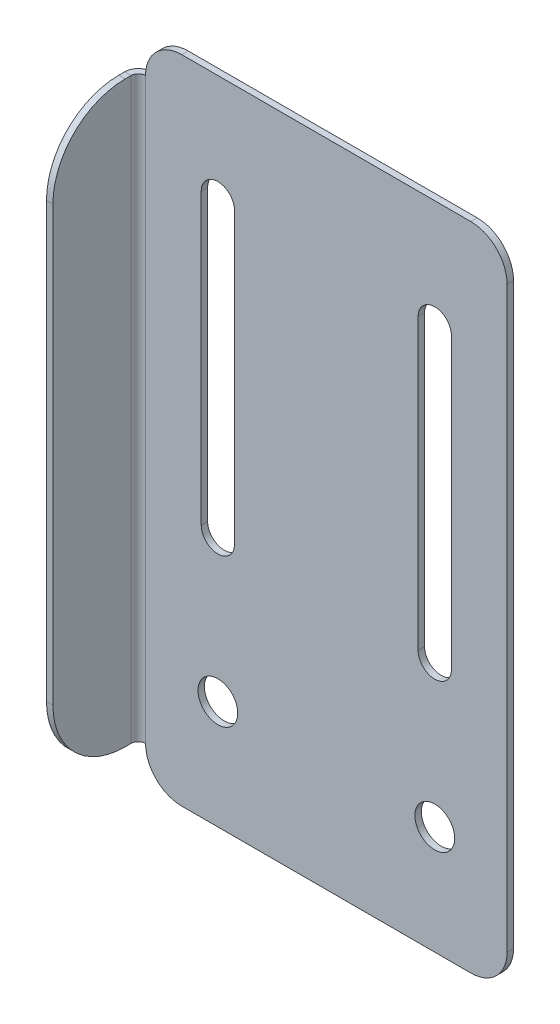
ISO-10303-21;
HEADER;
FILE_DESCRIPTION(('STEP AP214'),'2;1');
FILE_NAME('part.step','',(''),(''),'','','');
FILE_SCHEMA(('AUTOMOTIVE_DESIGN { 1 0 10303 214 1 1 1 1 }'));
ENDSEC;
DATA;
#1=APPLICATION_CONTEXT('core data for automotive mechanical design processes');
#2=APPLICATION_PROTOCOL_DEFINITION('international standard','automotive_design',2000,#1);
#3=PRODUCT_CONTEXT('',#1,'mechanical');
#4=PRODUCT('Part','Part','',(#3));
#5=PRODUCT_RELATED_PRODUCT_CATEGORY('part','',(#4));
#6=PRODUCT_DEFINITION_FORMATION('','',#4);
#7=PRODUCT_DEFINITION_CONTEXT('part definition',#1,'design');
#8=PRODUCT_DEFINITION('design','',#6,#7);
#9=PRODUCT_DEFINITION_SHAPE('','',#8);
#10=(LENGTH_UNIT() NAMED_UNIT(*) SI_UNIT(.MILLI.,.METRE.));
#11=(NAMED_UNIT(*) PLANE_ANGLE_UNIT() SI_UNIT($,.RADIAN.));
#12=(NAMED_UNIT(*) SI_UNIT($,.STERADIAN.) SOLID_ANGLE_UNIT());
#13=UNCERTAINTY_MEASURE_WITH_UNIT(LENGTH_MEASURE(1.E-05),#10,'distance_accuracy_value','');
#14=(GEOMETRIC_REPRESENTATION_CONTEXT(3) GLOBAL_UNCERTAINTY_ASSIGNED_CONTEXT((#13)) GLOBAL_UNIT_ASSIGNED_CONTEXT((#10,
#11,#12)) REPRESENTATION_CONTEXT('',''));
#15=CARTESIAN_POINT('',(0.,0.,0.));
#16=DIRECTION('',(0.,0.,1.));
#17=DIRECTION('',(1.,0.,0.));
#18=AXIS2_PLACEMENT_3D('',#15,#16,#17);
#19=CARTESIAN_POINT('',(0.,0.,0.889));
#20=DIRECTION('',(0.,0.,1.));
#21=DIRECTION('',(1.,0.,0.));
#22=AXIS2_PLACEMENT_3D('',#19,#20,#21);
#23=PLANE('',#22);
#24=CARTESIAN_POINT('',(61.7015913794371,-41.5,0.889));
#25=DIRECTION('',(0.,0.,-1.));
#26=DIRECTION('',(-1.,0.,0.));
#27=AXIS2_PLACEMENT_3D('',#24,#25,#26);
#28=CIRCLE('',#27,2.75);
#29=CARTESIAN_POINT('',(58.9515913794371,-41.5,0.889));
#30=VERTEX_POINT('',#29);
#31=EDGE_CURVE('E260',#30,#30,#28,.T.);
#32=ORIENTED_EDGE('',*,*,#31,.T.);
#33=EDGE_LOOP('',(#32));
#34=FACE_BOUND('',#33,.T.);
#35=DIRECTION('',(0.,-1.,0.));
#36=VECTOR('',#35,1.);
#37=CARTESIAN_POINT('',(64.0015913794371,-21.5,0.889));
#38=LINE('',#37,#36);
#39=CARTESIAN_POINT('',(64.0015913794371,18.5,0.889));
#40=VERTEX_POINT('',#39);
#41=CARTESIAN_POINT('',(64.0015913794371,-21.5,0.889));
#42=VERTEX_POINT('',#41);
#43=EDGE_CURVE('E303',#40,#42,#38,.T.);
#44=ORIENTED_EDGE('',*,*,#43,.T.);
#45=CARTESIAN_POINT('',(61.7015913794371,-21.5,0.889));
#46=DIRECTION('',(0.,0.,-1.));
#47=DIRECTION('',(-1.,0.,0.));
#48=AXIS2_PLACEMENT_3D('',#45,#46,#47);
#49=CIRCLE('',#48,2.29999999999998);
#50=CARTESIAN_POINT('',(59.4015913794371,-21.5,0.889));
#51=VERTEX_POINT('',#50);
#52=EDGE_CURVE('E299',#42,#51,#49,.T.);
#53=ORIENTED_EDGE('',*,*,#52,.T.);
#54=DIRECTION('',(0.,1.,0.));
#55=VECTOR('',#54,1.);
#56=CARTESIAN_POINT('',(59.4015913794371,-21.5,0.889));
#57=LINE('',#56,#55);
#58=CARTESIAN_POINT('',(59.4015913794371,18.5,0.889));
#59=VERTEX_POINT('',#58);
#60=EDGE_CURVE('E313',#51,#59,#57,.T.);
#61=ORIENTED_EDGE('',*,*,#60,.T.);
#62=CARTESIAN_POINT('',(61.7015913794371,18.5,0.889));
#63=DIRECTION('',(0.,0.,-1.));
#64=DIRECTION('',(-1.,0.,0.));
#65=AXIS2_PLACEMENT_3D('',#62,#63,#64);
#66=CIRCLE('',#65,2.29999999999999);
#67=EDGE_CURVE('E316',#59,#40,#66,.T.);
#68=ORIENTED_EDGE('',*,*,#67,.T.);
#69=EDGE_LOOP('',(#44,#53,#61,#68));
#70=FACE_BOUND('',#69,.T.);
#71=DIRECTION('',(-1.,0.,0.));
#72=VECTOR('',#71,1.);
#73=CARTESIAN_POINT('',(101.701591379437,33.5,0.889));
#74=LINE('',#73,#72);
#75=CARTESIAN_POINT('',(96.7015913794371,33.5,0.889));
#76=VERTEX_POINT('',#75);
#77=CARTESIAN_POINT('',(56.7015913794371,33.5,0.889));
#78=VERTEX_POINT('',#77);
#79=EDGE_CURVE('E340',#76,#78,#74,.T.);
#80=ORIENTED_EDGE('',*,*,#79,.T.);
#81=CARTESIAN_POINT('',(56.7015913794371,28.5,0.889));
#82=DIRECTION('',(0.,0.,1.));
#83=DIRECTION('',(1.,0.,0.));
#84=AXIS2_PLACEMENT_3D('',#81,#82,#83);
#85=CIRCLE('',#84,5.);
#86=CARTESIAN_POINT('',(51.7015913794371,28.5,0.889));
#87=VERTEX_POINT('',#86);
#88=EDGE_CURVE('E363',#78,#87,#85,.T.);
#89=ORIENTED_EDGE('',*,*,#88,.T.);
#90=DIRECTION('',(0.,-1.,0.));
#91=VECTOR('',#90,1.);
#92=CARTESIAN_POINT('',(51.7015913794371,-56.5,0.889));
#93=LINE('',#92,#91);
#94=CARTESIAN_POINT('',(51.7015913794371,-51.5,0.889));
#95=VERTEX_POINT('',#94);
#96=EDGE_CURVE('E330',#87,#95,#93,.T.);
#97=ORIENTED_EDGE('',*,*,#96,.T.);
#98=CARTESIAN_POINT('',(56.7015913794371,-51.5,0.889));
#99=DIRECTION('',(0.,0.,1.));
#100=DIRECTION('',(1.,0.,0.));
#101=AXIS2_PLACEMENT_3D('',#98,#99,#100);
#102=CIRCLE('',#101,5.);
#103=CARTESIAN_POINT('',(56.7015913794371,-56.5,0.889));
#104=VERTEX_POINT('',#103);
#105=EDGE_CURVE('E357',#95,#104,#102,.T.);
#106=ORIENTED_EDGE('',*,*,#105,.T.);
#107=DIRECTION('',(1.,0.,0.));
#108=VECTOR('',#107,1.);
#109=CARTESIAN_POINT('',(51.7015913794371,-56.5,0.889));
#110=LINE('',#109,#108);
#111=CARTESIAN_POINT('',(96.7015913794371,-56.5,0.889));
#112=VERTEX_POINT('',#111);
#113=EDGE_CURVE('E333',#104,#112,#110,.T.);
#114=ORIENTED_EDGE('',*,*,#113,.T.);
#115=CARTESIAN_POINT('',(96.7015913794371,-51.5,0.889));
#116=DIRECTION('',(0.,0.,1.));
#117=DIRECTION('',(1.,0.,0.));
#118=AXIS2_PLACEMENT_3D('',#115,#116,#117);
#119=CIRCLE('',#118,5.);
#120=CARTESIAN_POINT('',(101.701591379437,-51.5,0.889));
#121=VERTEX_POINT('',#120);
#122=EDGE_CURVE('E359',#112,#121,#119,.T.);
#123=ORIENTED_EDGE('',*,*,#122,.T.);
#124=DIRECTION('',(0.,1.,0.));
#125=VECTOR('',#124,1.);
#126=CARTESIAN_POINT('',(101.701591379437,-56.5,0.889));
#127=LINE('',#126,#125);
#128=CARTESIAN_POINT('',(101.701591379437,28.5,0.889));
#129=VERTEX_POINT('',#128);
#130=EDGE_CURVE('E337',#121,#129,#127,.T.);
#131=ORIENTED_EDGE('',*,*,#130,.T.);
#132=CARTESIAN_POINT('',(96.7015913794371,28.5,0.889));
#133=DIRECTION('',(0.,0.,1.));
#134=DIRECTION('',(1.,0.,0.));
#135=AXIS2_PLACEMENT_3D('',#132,#133,#134);
#136=CIRCLE('',#135,5.);
#137=EDGE_CURVE('E361',#129,#76,#136,.T.);
#138=ORIENTED_EDGE('',*,*,#137,.T.);
#139=EDGE_LOOP('',(#80,#89,#97,#106,#114,#123,#131,#138));
#140=FACE_BOUND('',#139,.T.);
#141=DIRECTION('',(0.,-1.,0.));
#142=VECTOR('',#141,1.);
#143=CARTESIAN_POINT('',(94.0015913794371,-21.5,0.889));
#144=LINE('',#143,#142);
#145=CARTESIAN_POINT('',(94.0015913794371,18.5,0.889));
#146=VERTEX_POINT('',#145);
#147=CARTESIAN_POINT('',(94.0015913794371,-21.5,0.889));
#148=VERTEX_POINT('',#147);
#149=EDGE_CURVE('E272',#146,#148,#144,.T.);
#150=ORIENTED_EDGE('',*,*,#149,.T.);
#151=CARTESIAN_POINT('',(91.7015913794371,-21.5,0.889));
#152=DIRECTION('',(0.,0.,-1.));
#153=DIRECTION('',(-1.,0.,0.));
#154=AXIS2_PLACEMENT_3D('',#151,#152,#153);
#155=CIRCLE('',#154,2.29999999999998);
#156=CARTESIAN_POINT('',(89.4015913794371,-21.5,0.889));
#157=VERTEX_POINT('',#156);
#158=EDGE_CURVE('E266',#148,#157,#155,.T.);
#159=ORIENTED_EDGE('',*,*,#158,.T.);
#160=DIRECTION('',(0.,1.,0.));
#161=VECTOR('',#160,1.);
#162=CARTESIAN_POINT('',(89.4015913794371,-21.5,0.889));
#163=LINE('',#162,#161);
#164=CARTESIAN_POINT('',(89.4015913794371,18.5,0.889));
#165=VERTEX_POINT('',#164);
#166=EDGE_CURVE('E282',#157,#165,#163,.T.);
#167=ORIENTED_EDGE('',*,*,#166,.T.);
#168=CARTESIAN_POINT('',(91.7015913794371,18.5,0.889));
#169=DIRECTION('',(0.,0.,-1.));
#170=DIRECTION('',(-1.,0.,0.));
#171=AXIS2_PLACEMENT_3D('',#168,#169,#170);
#172=CIRCLE('',#171,2.29999999999998);
#173=EDGE_CURVE('E285',#165,#146,#172,.T.);
#174=ORIENTED_EDGE('',*,*,#173,.T.);
#175=EDGE_LOOP('',(#150,#159,#167,#174));
#176=FACE_BOUND('',#175,.T.);
#177=CARTESIAN_POINT('',(91.7015913794371,-41.5,0.889));
#178=DIRECTION('',(0.,0.,-1.));
#179=DIRECTION('',(-1.,0.,0.));
#180=AXIS2_PLACEMENT_3D('',#177,#178,#179);
#181=CIRCLE('',#180,2.75000000000001);
#182=CARTESIAN_POINT('',(88.9515913794371,-41.5,0.889));
#183=VERTEX_POINT('',#182);
#184=EDGE_CURVE('E252',#183,#183,#181,.T.);
#185=ORIENTED_EDGE('',*,*,#184,.T.);
#186=EDGE_LOOP('',(#185));
#187=FACE_BOUND('',#186,.T.);
#188=ADVANCED_FACE('F55',(#34,#70,#140,#176,#187),#23,.T.);
#189=CARTESIAN_POINT('',(0.,0.,0.));
#190=DIRECTION('',(0.,0.,1.));
#191=DIRECTION('',(1.,0.,0.));
#192=AXIS2_PLACEMENT_3D('',#189,#190,#191);
#193=PLANE('',#192);
#194=CARTESIAN_POINT('',(61.7015913794371,-41.5,0.));
#195=DIRECTION('',(0.,0.,-1.));
#196=DIRECTION('',(-1.,0.,0.));
#197=AXIS2_PLACEMENT_3D('',#194,#195,#196);
#198=CIRCLE('',#197,2.75);
#199=CARTESIAN_POINT('',(58.9515913794371,-41.5,0.));
#200=VERTEX_POINT('',#199);
#201=EDGE_CURVE('E263',#200,#200,#198,.T.);
#202=ORIENTED_EDGE('',*,*,#201,.F.);
#203=EDGE_LOOP('',(#202));
#204=FACE_BOUND('',#203,.T.);
#205=CARTESIAN_POINT('',(61.7015913794371,-21.5,0.));
#206=DIRECTION('',(0.,0.,-1.));
#207=DIRECTION('',(-1.,0.,0.));
#208=AXIS2_PLACEMENT_3D('',#205,#206,#207);
#209=CIRCLE('',#208,2.29999999999998);
#210=CARTESIAN_POINT('',(64.0015913794371,-21.5,0.));
#211=VERTEX_POINT('',#210);
#212=CARTESIAN_POINT('',(59.4015913794371,-21.5,0.));
#213=VERTEX_POINT('',#212);
#214=EDGE_CURVE('E300',#211,#213,#209,.T.);
#215=ORIENTED_EDGE('',*,*,#214,.F.);
#216=DIRECTION('',(0.,-1.,0.));
#217=VECTOR('',#216,1.);
#218=CARTESIAN_POINT('',(64.0015913794371,-21.5,0.));
#219=LINE('',#218,#217);
#220=CARTESIAN_POINT('',(64.0015913794371,18.5,0.));
#221=VERTEX_POINT('',#220);
#222=EDGE_CURVE('E308',#221,#211,#219,.T.);
#223=ORIENTED_EDGE('',*,*,#222,.F.);
#224=CARTESIAN_POINT('',(61.7015913794371,18.5,0.));
#225=DIRECTION('',(0.,0.,-1.));
#226=DIRECTION('',(-1.,0.,0.));
#227=AXIS2_PLACEMENT_3D('',#224,#225,#226);
#228=CIRCLE('',#227,2.29999999999999);
#229=CARTESIAN_POINT('',(59.4015913794371,18.5,0.));
#230=VERTEX_POINT('',#229);
#231=EDGE_CURVE('E305',#230,#221,#228,.T.);
#232=ORIENTED_EDGE('',*,*,#231,.F.);
#233=DIRECTION('',(0.,1.,0.));
#234=VECTOR('',#233,1.);
#235=CARTESIAN_POINT('',(59.4015913794371,-21.5,0.));
#236=LINE('',#235,#234);
#237=EDGE_CURVE('E302',#213,#230,#236,.T.);
#238=ORIENTED_EDGE('',*,*,#237,.F.);
#239=EDGE_LOOP('',(#215,#223,#232,#238));
#240=FACE_BOUND('',#239,.T.);
#241=DIRECTION('',(0.,1.,0.));
#242=VECTOR('',#241,1.);
#243=CARTESIAN_POINT('',(51.7015913794371,0.,0.));
#244=LINE('',#243,#242);
#245=CARTESIAN_POINT('',(51.7015913794371,28.5,0.));
#246=VERTEX_POINT('',#245);
#247=CARTESIAN_POINT('',(51.7015913794371,-51.5,0.));
#248=VERTEX_POINT('',#247);
#249=EDGE_CURVE('E215',#246,#248,#244,.F.);
#250=ORIENTED_EDGE('',*,*,#249,.F.);
#251=CARTESIAN_POINT('',(56.7015913794371,28.5,0.));
#252=DIRECTION('',(0.,0.,1.));
#253=DIRECTION('',(1.,0.,0.));
#254=AXIS2_PLACEMENT_3D('',#251,#252,#253);
#255=CIRCLE('',#254,5.);
#256=CARTESIAN_POINT('',(56.7015913794371,33.5,0.));
#257=VERTEX_POINT('',#256);
#258=EDGE_CURVE('E377',#246,#257,#255,.F.);
#259=ORIENTED_EDGE('',*,*,#258,.T.);
#260=DIRECTION('',(1.,0.,0.));
#261=VECTOR('',#260,1.);
#262=CARTESIAN_POINT('',(0.,33.5,0.));
#263=LINE('',#262,#261);
#264=CARTESIAN_POINT('',(96.7015913794371,33.5,0.));
#265=VERTEX_POINT('',#264);
#266=EDGE_CURVE('E334',#265,#257,#263,.F.);
#267=ORIENTED_EDGE('',*,*,#266,.F.);
#268=CARTESIAN_POINT('',(96.7015913794371,28.5,0.));
#269=DIRECTION('',(0.,0.,1.));
#270=DIRECTION('',(1.,0.,0.));
#271=AXIS2_PLACEMENT_3D('',#268,#269,#270);
#272=CIRCLE('',#271,5.);
#273=CARTESIAN_POINT('',(101.701591379437,28.5,0.));
#274=VERTEX_POINT('',#273);
#275=EDGE_CURVE('E375',#265,#274,#272,.F.);
#276=ORIENTED_EDGE('',*,*,#275,.T.);
#277=DIRECTION('',(0.,1.,0.));
#278=VECTOR('',#277,1.);
#279=CARTESIAN_POINT('',(101.701591379437,0.,0.));
#280=LINE('',#279,#278);
#281=CARTESIAN_POINT('',(101.701591379437,-51.5,0.));
#282=VERTEX_POINT('',#281);
#283=EDGE_CURVE('E348',#282,#274,#280,.T.);
#284=ORIENTED_EDGE('',*,*,#283,.F.);
#285=CARTESIAN_POINT('',(96.7015913794371,-51.5,0.));
#286=DIRECTION('',(0.,0.,1.));
#287=DIRECTION('',(1.,0.,0.));
#288=AXIS2_PLACEMENT_3D('',#285,#286,#287);
#289=CIRCLE('',#288,5.);
#290=CARTESIAN_POINT('',(96.7015913794371,-56.5,0.));
#291=VERTEX_POINT('',#290);
#292=EDGE_CURVE('E373',#282,#291,#289,.F.);
#293=ORIENTED_EDGE('',*,*,#292,.T.);
#294=DIRECTION('',(1.,0.,0.));
#295=VECTOR('',#294,1.);
#296=CARTESIAN_POINT('',(0.,-56.5,0.));
#297=LINE('',#296,#295);
#298=CARTESIAN_POINT('',(56.7015913794371,-56.5,0.));
#299=VERTEX_POINT('',#298);
#300=EDGE_CURVE('E345',#299,#291,#297,.T.);
#301=ORIENTED_EDGE('',*,*,#300,.F.);
#302=CARTESIAN_POINT('',(56.7015913794371,-51.5,0.));
#303=DIRECTION('',(0.,0.,1.));
#304=DIRECTION('',(1.,0.,0.));
#305=AXIS2_PLACEMENT_3D('',#302,#303,#304);
#306=CIRCLE('',#305,5.);
#307=EDGE_CURVE('E370',#299,#248,#306,.F.);
#308=ORIENTED_EDGE('',*,*,#307,.T.);
#309=EDGE_LOOP('',(#250,#259,#267,#276,#284,#293,#301,#308));
#310=FACE_BOUND('',#309,.T.);
#311=CARTESIAN_POINT('',(91.7015913794371,-21.5,0.));
#312=DIRECTION('',(0.,0.,-1.));
#313=DIRECTION('',(-1.,0.,0.));
#314=AXIS2_PLACEMENT_3D('',#311,#312,#313);
#315=CIRCLE('',#314,2.29999999999998);
#316=CARTESIAN_POINT('',(94.0015913794371,-21.5,0.));
#317=VERTEX_POINT('',#316);
#318=CARTESIAN_POINT('',(89.4015913794371,-21.5,0.));
#319=VERTEX_POINT('',#318);
#320=EDGE_CURVE('E269',#317,#319,#315,.T.);
#321=ORIENTED_EDGE('',*,*,#320,.F.);
#322=DIRECTION('',(0.,-1.,0.));
#323=VECTOR('',#322,1.);
#324=CARTESIAN_POINT('',(94.0015913794371,-21.5,0.));
#325=LINE('',#324,#323);
#326=CARTESIAN_POINT('',(94.0015913794371,18.5,0.));
#327=VERTEX_POINT('',#326);
#328=EDGE_CURVE('E277',#327,#317,#325,.T.);
#329=ORIENTED_EDGE('',*,*,#328,.F.);
#330=CARTESIAN_POINT('',(91.7015913794371,18.5,0.));
#331=DIRECTION('',(0.,0.,-1.));
#332=DIRECTION('',(-1.,0.,0.));
#333=AXIS2_PLACEMENT_3D('',#330,#331,#332);
#334=CIRCLE('',#333,2.29999999999998);
#335=CARTESIAN_POINT('',(89.4015913794371,18.5,0.));
#336=VERTEX_POINT('',#335);
#337=EDGE_CURVE('E274',#336,#327,#334,.T.);
#338=ORIENTED_EDGE('',*,*,#337,.F.);
#339=DIRECTION('',(0.,1.,0.));
#340=VECTOR('',#339,1.);
#341=CARTESIAN_POINT('',(89.4015913794371,-21.5,0.));
#342=LINE('',#341,#340);
#343=EDGE_CURVE('E271',#319,#336,#342,.T.);
#344=ORIENTED_EDGE('',*,*,#343,.F.);
#345=EDGE_LOOP('',(#321,#329,#338,#344));
#346=FACE_BOUND('',#345,.T.);
#347=CARTESIAN_POINT('',(91.7015913794371,-41.5,0.));
#348=DIRECTION('',(0.,0.,-1.));
#349=DIRECTION('',(-1.,0.,0.));
#350=AXIS2_PLACEMENT_3D('',#347,#348,#349);
#351=CIRCLE('',#350,2.75000000000001);
#352=CARTESIAN_POINT('',(88.9515913794371,-41.5,0.));
#353=VERTEX_POINT('',#352);
#354=EDGE_CURVE('E257',#353,#353,#351,.T.);
#355=ORIENTED_EDGE('',*,*,#354,.F.);
#356=EDGE_LOOP('',(#355));
#357=FACE_BOUND('',#356,.T.);
#358=ADVANCED_FACE('F429',(#204,#240,#310,#346,#357),#193,.F.);
#359=CARTESIAN_POINT('',(101.701591379437,-56.5,0.889));
#360=DIRECTION('',(1.,0.,0.));
#361=DIRECTION('',(0.,1.,0.));
#362=AXIS2_PLACEMENT_3D('',#359,#360,#361);
#363=PLANE('',#362);
#364=ORIENTED_EDGE('',*,*,#283,.T.);
#365=DIRECTION('',(0.,0.,1.));
#366=VECTOR('',#365,1.);
#367=CARTESIAN_POINT('',(101.701591379437,28.5,0.889));
#368=LINE('',#367,#366);
#369=EDGE_CURVE('E381',#274,#129,#368,.T.);
#370=ORIENTED_EDGE('',*,*,#369,.T.);
#371=ORIENTED_EDGE('',*,*,#130,.F.);
#372=DIRECTION('',(0.,0.,1.));
#373=VECTOR('',#372,1.);
#374=CARTESIAN_POINT('',(101.701591379437,-51.5,0.889));
#375=LINE('',#374,#373);
#376=EDGE_CURVE('E379',#121,#282,#375,.F.);
#377=ORIENTED_EDGE('',*,*,#376,.T.);
#378=EDGE_LOOP('',(#364,#370,#371,#377));
#379=FACE_BOUND('',#378,.T.);
#380=ADVANCED_FACE('F442',(#379),#363,.T.);
#381=CARTESIAN_POINT('',(101.701591379437,33.5,0.889));
#382=DIRECTION('',(0.,1.,0.));
#383=DIRECTION('',(-1.,0.,0.));
#384=AXIS2_PLACEMENT_3D('',#381,#382,#383);
#385=PLANE('',#384);
#386=ORIENTED_EDGE('',*,*,#266,.T.);
#387=DIRECTION('',(0.,0.,1.));
#388=VECTOR('',#387,1.);
#389=CARTESIAN_POINT('',(56.7015913794371,33.5,0.889));
#390=LINE('',#389,#388);
#391=EDGE_CURVE('E354',#257,#78,#390,.T.);
#392=ORIENTED_EDGE('',*,*,#391,.T.);
#393=ORIENTED_EDGE('',*,*,#79,.F.);
#394=DIRECTION('',(0.,0.,1.));
#395=VECTOR('',#394,1.);
#396=CARTESIAN_POINT('',(96.7015913794371,33.5,0.889));
#397=LINE('',#396,#395);
#398=EDGE_CURVE('E343',#76,#265,#397,.F.);
#399=ORIENTED_EDGE('',*,*,#398,.T.);
#400=EDGE_LOOP('',(#386,#392,#393,#399));
#401=FACE_BOUND('',#400,.T.);
#402=ADVANCED_FACE('F433',(#401),#385,.T.);
#403=CARTESIAN_POINT('',(51.7015913794371,-56.5,0.889));
#404=DIRECTION('',(0.,-1.,0.));
#405=DIRECTION('',(1.,0.,0.));
#406=AXIS2_PLACEMENT_3D('',#403,#404,#405);
#407=PLANE('',#406);
#408=ORIENTED_EDGE('',*,*,#300,.T.);
#409=DIRECTION('',(0.,0.,1.));
#410=VECTOR('',#409,1.);
#411=CARTESIAN_POINT('',(96.7015913794371,-56.5,0.889));
#412=LINE('',#411,#410);
#413=EDGE_CURVE('E386',#291,#112,#412,.T.);
#414=ORIENTED_EDGE('',*,*,#413,.T.);
#415=ORIENTED_EDGE('',*,*,#113,.F.);
#416=DIRECTION('',(0.,0.,1.));
#417=VECTOR('',#416,1.);
#418=CARTESIAN_POINT('',(56.7015913794371,-56.5,0.889));
#419=LINE('',#418,#417);
#420=EDGE_CURVE('E384',#104,#299,#419,.F.);
#421=ORIENTED_EDGE('',*,*,#420,.T.);
#422=EDGE_LOOP('',(#408,#414,#415,#421));
#423=FACE_BOUND('',#422,.T.);
#424=ADVANCED_FACE('F451',(#423),#407,.T.);
#425=CARTESIAN_POINT('',(61.7015913794371,-21.5,0.));
#426=DIRECTION('',(0.,0.,1.));
#427=DIRECTION('',(1.,0.,0.));
#428=AXIS2_PLACEMENT_3D('',#425,#426,#427);
#429=CYLINDRICAL_SURFACE('',#428,2.29999999999998);
#430=ORIENTED_EDGE('',*,*,#52,.F.);
#431=DIRECTION('',(0.,0.,1.));
#432=VECTOR('',#431,1.);
#433=CARTESIAN_POINT('',(64.0015913794371,-21.5,0.));
#434=LINE('',#433,#432);
#435=EDGE_CURVE('E310',#211,#42,#434,.T.);
#436=ORIENTED_EDGE('',*,*,#435,.F.);
#437=ORIENTED_EDGE('',*,*,#214,.T.);
#438=DIRECTION('',(0.,0.,1.));
#439=VECTOR('',#438,1.);
#440=CARTESIAN_POINT('',(59.4015913794371,-21.5,0.));
#441=LINE('',#440,#439);
#442=EDGE_CURVE('E327',#213,#51,#441,.T.);
#443=ORIENTED_EDGE('',*,*,#442,.T.);
#444=EDGE_LOOP('',(#430,#436,#437,#443));
#445=FACE_BOUND('',#444,.T.);
#446=ADVANCED_FACE('F507',(#445),#429,.F.);
#447=CARTESIAN_POINT('',(59.4015913794371,-21.5,0.));
#448=DIRECTION('',(1.,0.,0.));
#449=DIRECTION('',(0.,1.,0.));
#450=AXIS2_PLACEMENT_3D('',#447,#448,#449);
#451=PLANE('',#450);
#452=ORIENTED_EDGE('',*,*,#60,.F.);
#453=ORIENTED_EDGE('',*,*,#442,.F.);
#454=ORIENTED_EDGE('',*,*,#237,.T.);
#455=DIRECTION('',(0.,0.,1.));
#456=VECTOR('',#455,1.);
#457=CARTESIAN_POINT('',(59.4015913794371,18.5,0.));
#458=LINE('',#457,#456);
#459=EDGE_CURVE('E325',#230,#59,#458,.T.);
#460=ORIENTED_EDGE('',*,*,#459,.T.);
#461=EDGE_LOOP('',(#452,#453,#454,#460));
#462=FACE_BOUND('',#461,.T.);
#463=ADVANCED_FACE('F503',(#462),#451,.T.);
#464=CARTESIAN_POINT('',(61.7015913794371,18.5,0.));
#465=DIRECTION('',(0.,0.,1.));
#466=DIRECTION('',(1.,0.,0.));
#467=AXIS2_PLACEMENT_3D('',#464,#465,#466);
#468=CYLINDRICAL_SURFACE('',#467,2.29999999999999);
#469=ORIENTED_EDGE('',*,*,#67,.F.);
#470=ORIENTED_EDGE('',*,*,#459,.F.);
#471=ORIENTED_EDGE('',*,*,#231,.T.);
#472=DIRECTION('',(0.,0.,1.));
#473=VECTOR('',#472,1.);
#474=CARTESIAN_POINT('',(64.0015913794371,18.5,0.));
#475=LINE('',#474,#473);
#476=EDGE_CURVE('E323',#221,#40,#475,.T.);
#477=ORIENTED_EDGE('',*,*,#476,.T.);
#478=EDGE_LOOP('',(#469,#470,#471,#477));
#479=FACE_BOUND('',#478,.T.);
#480=ADVANCED_FACE('F499',(#479),#468,.F.);
#481=CARTESIAN_POINT('',(64.0015913794371,-21.5,0.));
#482=DIRECTION('',(-1.,0.,0.));
#483=DIRECTION('',(0.,-1.,0.));
#484=AXIS2_PLACEMENT_3D('',#481,#482,#483);
#485=PLANE('',#484);
#486=ORIENTED_EDGE('',*,*,#43,.F.);
#487=ORIENTED_EDGE('',*,*,#476,.F.);
#488=ORIENTED_EDGE('',*,*,#222,.T.);
#489=ORIENTED_EDGE('',*,*,#435,.T.);
#490=EDGE_LOOP('',(#486,#487,#488,#489));
#491=FACE_BOUND('',#490,.T.);
#492=ADVANCED_FACE('F495',(#491),#485,.T.);
#493=CARTESIAN_POINT('',(91.7015913794371,-21.5,0.));
#494=DIRECTION('',(0.,0.,1.));
#495=DIRECTION('',(1.,0.,0.));
#496=AXIS2_PLACEMENT_3D('',#493,#494,#495);
#497=CYLINDRICAL_SURFACE('',#496,2.29999999999998);
#498=ORIENTED_EDGE('',*,*,#158,.F.);
#499=DIRECTION('',(0.,0.,1.));
#500=VECTOR('',#499,1.);
#501=CARTESIAN_POINT('',(94.0015913794371,-21.5,0.));
#502=LINE('',#501,#500);
#503=EDGE_CURVE('E279',#317,#148,#502,.T.);
#504=ORIENTED_EDGE('',*,*,#503,.F.);
#505=ORIENTED_EDGE('',*,*,#320,.T.);
#506=DIRECTION('',(0.,0.,1.));
#507=VECTOR('',#506,1.);
#508=CARTESIAN_POINT('',(89.4015913794371,-21.5,0.));
#509=LINE('',#508,#507);
#510=EDGE_CURVE('E296',#319,#157,#509,.T.);
#511=ORIENTED_EDGE('',*,*,#510,.T.);
#512=EDGE_LOOP('',(#498,#504,#505,#511));
#513=FACE_BOUND('',#512,.T.);
#514=ADVANCED_FACE('F491',(#513),#497,.F.);
#515=CARTESIAN_POINT('',(89.4015913794371,-21.5,0.));
#516=DIRECTION('',(1.,0.,0.));
#517=DIRECTION('',(0.,1.,0.));
#518=AXIS2_PLACEMENT_3D('',#515,#516,#517);
#519=PLANE('',#518);
#520=ORIENTED_EDGE('',*,*,#166,.F.);
#521=ORIENTED_EDGE('',*,*,#510,.F.);
#522=ORIENTED_EDGE('',*,*,#343,.T.);
#523=DIRECTION('',(0.,0.,1.));
#524=VECTOR('',#523,1.);
#525=CARTESIAN_POINT('',(89.4015913794371,18.5,0.));
#526=LINE('',#525,#524);
#527=EDGE_CURVE('E294',#336,#165,#526,.T.);
#528=ORIENTED_EDGE('',*,*,#527,.T.);
#529=EDGE_LOOP('',(#520,#521,#522,#528));
#530=FACE_BOUND('',#529,.T.);
#531=ADVANCED_FACE('F487',(#530),#519,.T.);
#532=CARTESIAN_POINT('',(91.7015913794371,18.5,0.));
#533=DIRECTION('',(0.,0.,1.));
#534=DIRECTION('',(1.,0.,0.));
#535=AXIS2_PLACEMENT_3D('',#532,#533,#534);
#536=CYLINDRICAL_SURFACE('',#535,2.29999999999998);
#537=ORIENTED_EDGE('',*,*,#173,.F.);
#538=ORIENTED_EDGE('',*,*,#527,.F.);
#539=ORIENTED_EDGE('',*,*,#337,.T.);
#540=DIRECTION('',(0.,0.,1.));
#541=VECTOR('',#540,1.);
#542=CARTESIAN_POINT('',(94.0015913794371,18.5,0.));
#543=LINE('',#542,#541);
#544=EDGE_CURVE('E292',#327,#146,#543,.T.);
#545=ORIENTED_EDGE('',*,*,#544,.T.);
#546=EDGE_LOOP('',(#537,#538,#539,#545));
#547=FACE_BOUND('',#546,.T.);
#548=ADVANCED_FACE('F483',(#547),#536,.F.);
#549=CARTESIAN_POINT('',(94.0015913794371,-21.5,0.));
#550=DIRECTION('',(-1.,0.,0.));
#551=DIRECTION('',(0.,-1.,0.));
#552=AXIS2_PLACEMENT_3D('',#549,#550,#551);
#553=PLANE('',#552);
#554=ORIENTED_EDGE('',*,*,#149,.F.);
#555=ORIENTED_EDGE('',*,*,#544,.F.);
#556=ORIENTED_EDGE('',*,*,#328,.T.);
#557=ORIENTED_EDGE('',*,*,#503,.T.);
#558=EDGE_LOOP('',(#554,#555,#556,#557));
#559=FACE_BOUND('',#558,.T.);
#560=ADVANCED_FACE('F475',(#559),#553,.T.);
#561=CARTESIAN_POINT('',(61.7015913794371,-41.5,0.));
#562=DIRECTION('',(0.,0.,1.));
#563=DIRECTION('',(1.,0.,0.));
#564=AXIS2_PLACEMENT_3D('',#561,#562,#563);
#565=CYLINDRICAL_SURFACE('',#564,2.75);
#566=ORIENTED_EDGE('',*,*,#201,.T.);
#567=EDGE_LOOP('',(#566));
#568=FACE_BOUND('',#567,.T.);
#569=ORIENTED_EDGE('',*,*,#31,.F.);
#570=EDGE_LOOP('',(#569));
#571=FACE_BOUND('',#570,.T.);
#572=ADVANCED_FACE('F467',(#568,#571),#565,.F.);
#573=CARTESIAN_POINT('',(91.7015913794371,-41.5,0.));
#574=DIRECTION('',(0.,0.,1.));
#575=DIRECTION('',(1.,0.,0.));
#576=AXIS2_PLACEMENT_3D('',#573,#574,#575);
#577=CYLINDRICAL_SURFACE('',#576,2.75000000000001);
#578=ORIENTED_EDGE('',*,*,#354,.T.);
#579=EDGE_LOOP('',(#578));
#580=FACE_BOUND('',#579,.T.);
#581=ORIENTED_EDGE('',*,*,#184,.F.);
#582=EDGE_LOOP('',(#581));
#583=FACE_BOUND('',#582,.T.);
#584=ADVANCED_FACE('F465',(#580,#583),#577,.F.);
#585=CARTESIAN_POINT('',(56.7015913794371,28.5,0.889));
#586=DIRECTION('',(0.,0.,1.));
#587=DIRECTION('',(1.,0.,0.));
#588=AXIS2_PLACEMENT_3D('',#585,#586,#587);
#589=CYLINDRICAL_SURFACE('',#588,5.);
#590=ORIENTED_EDGE('',*,*,#258,.F.);
#591=DIRECTION('',(0.,0.,1.));
#592=VECTOR('',#591,1.);
#593=CARTESIAN_POINT('',(51.7015913794371,28.5,0.889));
#594=LINE('',#593,#592);
#595=EDGE_CURVE('E367',#87,#246,#594,.F.);
#596=ORIENTED_EDGE('',*,*,#595,.F.);
#597=ORIENTED_EDGE('',*,*,#88,.F.);
#598=ORIENTED_EDGE('',*,*,#391,.F.);
#599=EDGE_LOOP('',(#590,#596,#597,#598));
#600=FACE_BOUND('',#599,.T.);
#601=ADVANCED_FACE('F425',(#600),#589,.T.);
#602=CARTESIAN_POINT('',(96.7015913794371,28.5,0.889));
#603=DIRECTION('',(0.,0.,1.));
#604=DIRECTION('',(1.,0.,0.));
#605=AXIS2_PLACEMENT_3D('',#602,#603,#604);
#606=CYLINDRICAL_SURFACE('',#605,5.);
#607=ORIENTED_EDGE('',*,*,#275,.F.);
#608=ORIENTED_EDGE('',*,*,#398,.F.);
#609=ORIENTED_EDGE('',*,*,#137,.F.);
#610=ORIENTED_EDGE('',*,*,#369,.F.);
#611=EDGE_LOOP('',(#607,#608,#609,#610));
#612=FACE_BOUND('',#611,.T.);
#613=ADVANCED_FACE('F437',(#612),#606,.T.);
#614=CARTESIAN_POINT('',(96.7015913794371,-51.5,0.889));
#615=DIRECTION('',(0.,0.,1.));
#616=DIRECTION('',(1.,0.,0.));
#617=AXIS2_PLACEMENT_3D('',#614,#615,#616);
#618=CYLINDRICAL_SURFACE('',#617,5.);
#619=ORIENTED_EDGE('',*,*,#292,.F.);
#620=ORIENTED_EDGE('',*,*,#376,.F.);
#621=ORIENTED_EDGE('',*,*,#122,.F.);
#622=ORIENTED_EDGE('',*,*,#413,.F.);
#623=EDGE_LOOP('',(#619,#620,#621,#622));
#624=FACE_BOUND('',#623,.T.);
#625=ADVANCED_FACE('F446',(#624),#618,.T.);
#626=CARTESIAN_POINT('',(56.7015913794371,-51.5,0.889));
#627=DIRECTION('',(0.,0.,1.));
#628=DIRECTION('',(1.,0.,0.));
#629=AXIS2_PLACEMENT_3D('',#626,#627,#628);
#630=CYLINDRICAL_SURFACE('',#629,5.);
#631=ORIENTED_EDGE('',*,*,#307,.F.);
#632=ORIENTED_EDGE('',*,*,#420,.F.);
#633=ORIENTED_EDGE('',*,*,#105,.F.);
#634=DIRECTION('',(0.,0.,1.));
#635=VECTOR('',#634,1.);
#636=CARTESIAN_POINT('',(51.7015913794371,-51.5,0.889));
#637=LINE('',#636,#635);
#638=EDGE_CURVE('E365',#248,#95,#637,.T.);
#639=ORIENTED_EDGE('',*,*,#638,.F.);
#640=EDGE_LOOP('',(#631,#632,#633,#639));
#641=FACE_BOUND('',#640,.T.);
#642=ADVANCED_FACE('F455',(#641),#630,.T.);
#643=CARTESIAN_POINT('',(51.7015913794371,28.5,1.889));
#644=DIRECTION('',(0.,1.,0.));
#645=DIRECTION('',(0.,0.,1.));
#646=AXIS2_PLACEMENT_3D('',#643,#644,#645);
#647=PLANE('',#646);
#648=DIRECTION('',(1.,0.,0.));
#649=VECTOR('',#648,1.);
#650=CARTESIAN_POINT('',(49.8125913794371,28.5,1.88899999999999));
#651=LINE('',#650,#649);
#652=CARTESIAN_POINT('',(50.7015913794371,28.5,1.88899999999999));
#653=VERTEX_POINT('',#652);
#654=CARTESIAN_POINT('',(49.8125913794371,28.5,1.88899999999999));
#655=VERTEX_POINT('',#654);
#656=EDGE_CURVE('E249',#653,#655,#651,.F.);
#657=ORIENTED_EDGE('',*,*,#656,.F.);
#658=CARTESIAN_POINT('',(51.7015913794371,28.5,1.889));
#659=DIRECTION('',(0.,-1.,0.));
#660=DIRECTION('',(0.,0.,-1.));
#661=AXIS2_PLACEMENT_3D('',#658,#659,#660);
#662=CIRCLE('',#661,1.00000000000001);
#663=EDGE_CURVE('E219',#87,#653,#662,.F.);
#664=ORIENTED_EDGE('',*,*,#663,.F.);
#665=ORIENTED_EDGE('',*,*,#595,.T.);
#666=CARTESIAN_POINT('',(51.7015913794371,28.5,1.889));
#667=DIRECTION('',(0.,-1.,0.));
#668=DIRECTION('',(0.,0.,-1.));
#669=AXIS2_PLACEMENT_3D('',#666,#667,#668);
#670=CIRCLE('',#669,1.88900000000001);
#671=EDGE_CURVE('E218',#246,#655,#670,.F.);
#672=ORIENTED_EDGE('',*,*,#671,.T.);
#673=EDGE_LOOP('',(#657,#664,#665,#672));
#674=FACE_BOUND('',#673,.T.);
#675=ADVANCED_FACE('F421',(#674),#647,.T.);
#676=CARTESIAN_POINT('',(51.7015913794371,-51.5,1.88900000000001));
#677=DIRECTION('',(0.,1.,0.));
#678=DIRECTION('',(0.,0.,1.));
#679=AXIS2_PLACEMENT_3D('',#676,#677,#678);
#680=PLANE('',#679);
#681=CARTESIAN_POINT('',(51.7015913794371,-51.5,1.88900000000001));
#682=DIRECTION('',(0.,-1.,0.));
#683=DIRECTION('',(0.,0.,-1.));
#684=AXIS2_PLACEMENT_3D('',#681,#682,#683);
#685=CIRCLE('',#684,1.00000000000001);
#686=CARTESIAN_POINT('',(50.7015913794371,-51.5,1.889));
#687=VERTEX_POINT('',#686);
#688=EDGE_CURVE('E226',#687,#95,#685,.T.);
#689=ORIENTED_EDGE('',*,*,#688,.F.);
#690=DIRECTION('',(1.,0.,0.));
#691=VECTOR('',#690,1.);
#692=CARTESIAN_POINT('',(50.7015913794371,-51.5,1.889));
#693=LINE('',#692,#691);
#694=CARTESIAN_POINT('',(49.8125913794371,-51.5,1.889));
#695=VERTEX_POINT('',#694);
#696=EDGE_CURVE('E223',#687,#695,#693,.F.);
#697=ORIENTED_EDGE('',*,*,#696,.T.);
#698=CARTESIAN_POINT('',(51.7015913794371,-51.5,1.88900000000001));
#699=DIRECTION('',(0.,-1.,0.));
#700=DIRECTION('',(0.,0.,-1.));
#701=AXIS2_PLACEMENT_3D('',#698,#699,#700);
#702=CIRCLE('',#701,1.88900000000001);
#703=EDGE_CURVE('E208',#695,#248,#702,.T.);
#704=ORIENTED_EDGE('',*,*,#703,.T.);
#705=ORIENTED_EDGE('',*,*,#638,.T.);
#706=EDGE_LOOP('',(#689,#697,#704,#705));
#707=FACE_BOUND('',#706,.T.);
#708=ADVANCED_FACE('F224',(#707),#680,.F.);
#709=CARTESIAN_POINT('',(51.7015913794371,-51.5,1.88900000000001));
#710=DIRECTION('',(0.,-1.,0.));
#711=DIRECTION('',(-1.,0.,0.));
#712=AXIS2_PLACEMENT_3D('',#709,#710,#711);
#713=CYLINDRICAL_SURFACE('',#712,1.88900000000001);
#714=ORIENTED_EDGE('',*,*,#249,.T.);
#715=ORIENTED_EDGE('',*,*,#703,.F.);
#716=DIRECTION('',(0.,-1.,0.));
#717=VECTOR('',#716,1.);
#718=CARTESIAN_POINT('',(49.8125913794371,0.,1.88899999999999));
#719=LINE('',#718,#717);
#720=EDGE_CURVE('E213',#655,#695,#719,.T.);
#721=ORIENTED_EDGE('',*,*,#720,.F.);
#722=ORIENTED_EDGE('',*,*,#671,.F.);
#723=EDGE_LOOP('',(#714,#715,#721,#722));
#724=FACE_BOUND('',#723,.T.);
#725=ADVANCED_FACE('F210',(#724),#713,.T.);
#726=CARTESIAN_POINT('',(51.7015913794371,-51.5,1.88900000000001));
#727=DIRECTION('',(0.,-1.,0.));
#728=DIRECTION('',(-1.,0.,0.));
#729=AXIS2_PLACEMENT_3D('',#726,#727,#728);
#730=CYLINDRICAL_SURFACE('',#729,1.00000000000001);
#731=ORIENTED_EDGE('',*,*,#96,.F.);
#732=ORIENTED_EDGE('',*,*,#663,.T.);
#733=DIRECTION('',(0.,1.,0.));
#734=VECTOR('',#733,1.);
#735=CARTESIAN_POINT('',(50.7015913794371,28.5,1.88899999999999));
#736=LINE('',#735,#734);
#737=EDGE_CURVE('E228',#653,#687,#736,.F.);
#738=ORIENTED_EDGE('',*,*,#737,.T.);
#739=ORIENTED_EDGE('',*,*,#688,.T.);
#740=EDGE_LOOP('',(#731,#732,#738,#739));
#741=FACE_BOUND('',#740,.T.);
#742=ADVANCED_FACE('F418',(#741),#730,.F.);
#743=CARTESIAN_POINT('',(49.8125913794371,-51.5,0.888999999999997));
#744=DIRECTION('',(0.,1.,0.));
#745=DIRECTION('',(0.,0.,1.));
#746=AXIS2_PLACEMENT_3D('',#743,#744,#745);
#747=PLANE('',#746);
#748=DIRECTION('',(0.,0.,1.));
#749=VECTOR('',#748,1.);
#750=CARTESIAN_POINT('',(50.7015913794371,-51.5,0.889));
#751=LINE('',#750,#749);
#752=CARTESIAN_POINT('',(50.7015913794371,-51.5,2.70000000000001));
#753=VERTEX_POINT('',#752);
#754=EDGE_CURVE('E234',#687,#753,#751,.T.);
#755=ORIENTED_EDGE('',*,*,#754,.T.);
#756=DIRECTION('',(1.,0.,0.));
#757=VECTOR('',#756,1.);
#758=CARTESIAN_POINT('',(49.8125913794371,-51.5,2.70000000000001));
#759=LINE('',#758,#757);
#760=CARTESIAN_POINT('',(49.8125913794371,-51.5,2.70000000000001));
#761=VERTEX_POINT('',#760);
#762=EDGE_CURVE('E78',#753,#761,#759,.F.);
#763=ORIENTED_EDGE('',*,*,#762,.T.);
#764=DIRECTION('',(0.,0.,-1.));
#765=VECTOR('',#764,1.);
#766=CARTESIAN_POINT('',(49.8125913794371,-51.5,2.39654282858028E-13));
#767=LINE('',#766,#765);
#768=EDGE_CURVE('E231',#695,#761,#767,.F.);
#769=ORIENTED_EDGE('',*,*,#768,.F.);
#770=ORIENTED_EDGE('',*,*,#696,.F.);
#771=EDGE_LOOP('',(#755,#763,#769,#770));
#772=FACE_BOUND('',#771,.T.);
#773=ADVANCED_FACE('F236',(#772),#747,.F.);
#774=CARTESIAN_POINT('',(49.8125913794371,28.5,12.7));
#775=DIRECTION('',(0.,-1.,0.));
#776=DIRECTION('',(0.,0.,-1.));
#777=AXIS2_PLACEMENT_3D('',#774,#775,#776);
#778=PLANE('',#777);
#779=DIRECTION('',(0.,0.,1.));
#780=VECTOR('',#779,1.);
#781=CARTESIAN_POINT('',(49.8125913794371,28.5,0.));
#782=LINE('',#781,#780);
#783=CARTESIAN_POINT('',(49.8125913794371,28.5,2.69999999999997));
#784=VERTEX_POINT('',#783);
#785=EDGE_CURVE('E233',#784,#655,#782,.F.);
#786=ORIENTED_EDGE('',*,*,#785,.F.);
#787=DIRECTION('',(1.,0.,0.));
#788=VECTOR('',#787,1.);
#789=CARTESIAN_POINT('',(49.8125913794371,28.5,2.69999999999997));
#790=LINE('',#789,#788);
#791=CARTESIAN_POINT('',(50.7015913794371,28.5,2.69999999999997));
#792=VERTEX_POINT('',#791);
#793=EDGE_CURVE('E13',#784,#792,#790,.T.);
#794=ORIENTED_EDGE('',*,*,#793,.T.);
#795=DIRECTION('',(0.,0.,-1.));
#796=VECTOR('',#795,1.);
#797=CARTESIAN_POINT('',(50.7015913794371,28.5,12.7));
#798=LINE('',#797,#796);
#799=EDGE_CURVE('E238',#792,#653,#798,.T.);
#800=ORIENTED_EDGE('',*,*,#799,.T.);
#801=ORIENTED_EDGE('',*,*,#656,.T.);
#802=EDGE_LOOP('',(#786,#794,#800,#801));
#803=FACE_BOUND('',#802,.T.);
#804=ADVANCED_FACE('F414',(#803),#778,.F.);
#805=CARTESIAN_POINT('',(49.8125913794371,0.,1.79142381062884E-13));
#806=DIRECTION('',(-1.,0.,0.));
#807=DIRECTION('',(0.,0.,1.));
#808=AXIS2_PLACEMENT_3D('',#805,#806,#807);
#809=PLANE('',#808);
#810=ORIENTED_EDGE('',*,*,#768,.T.);
#811=CARTESIAN_POINT('',(49.8125913794371,-41.5,2.7));
#812=DIRECTION('',(-1.,0.,0.));
#813=DIRECTION('',(0.,0.,1.));
#814=AXIS2_PLACEMENT_3D('',#811,#812,#813);
#815=CIRCLE('',#814,10.);
#816=CARTESIAN_POINT('',(49.8125913794371,-41.5,12.7));
#817=VERTEX_POINT('',#816);
#818=EDGE_CURVE('E63',#761,#817,#815,.T.);
#819=ORIENTED_EDGE('',*,*,#818,.T.);
#820=DIRECTION('',(0.,-1.,0.));
#821=VECTOR('',#820,1.);
#822=CARTESIAN_POINT('',(49.8125913794371,0.,12.7));
#823=LINE('',#822,#821);
#824=CARTESIAN_POINT('',(49.8125913794371,18.5,12.7));
#825=VERTEX_POINT('',#824);
#826=EDGE_CURVE('E237',#817,#825,#823,.F.);
#827=ORIENTED_EDGE('',*,*,#826,.T.);
#828=CARTESIAN_POINT('',(49.8125913794371,18.5,2.7));
#829=DIRECTION('',(-1.,0.,0.));
#830=DIRECTION('',(0.,0.,1.));
#831=AXIS2_PLACEMENT_3D('',#828,#829,#830);
#832=CIRCLE('',#831,10.);
#833=EDGE_CURVE('E70',#825,#784,#832,.T.);
#834=ORIENTED_EDGE('',*,*,#833,.T.);
#835=ORIENTED_EDGE('',*,*,#785,.T.);
#836=ORIENTED_EDGE('',*,*,#720,.T.);
#837=EDGE_LOOP('',(#810,#819,#827,#834,#835,#836));
#838=FACE_BOUND('',#837,.T.);
#839=ADVANCED_FACE('F230',(#838),#809,.T.);
#840=CARTESIAN_POINT('',(50.7015913794371,0.,1.82246307973116E-13));
#841=DIRECTION('',(-1.,0.,0.));
#842=DIRECTION('',(0.,0.,1.));
#843=AXIS2_PLACEMENT_3D('',#840,#841,#842);
#844=PLANE('',#843);
#845=DIRECTION('',(0.,1.,0.));
#846=VECTOR('',#845,1.);
#847=CARTESIAN_POINT('',(50.7015913794371,-51.5,12.7));
#848=LINE('',#847,#846);
#849=CARTESIAN_POINT('',(50.7015913794371,-41.5,12.7));
#850=VERTEX_POINT('',#849);
#851=CARTESIAN_POINT('',(50.7015913794371,18.5,12.7));
#852=VERTEX_POINT('',#851);
#853=EDGE_CURVE('E241',#850,#852,#848,.T.);
#854=ORIENTED_EDGE('',*,*,#853,.F.);
#855=CARTESIAN_POINT('',(50.7015913794371,-41.5,2.7));
#856=DIRECTION('',(-1.,0.,0.));
#857=DIRECTION('',(0.,0.,1.));
#858=AXIS2_PLACEMENT_3D('',#855,#856,#857);
#859=CIRCLE('',#858,10.);
#860=EDGE_CURVE('E396',#850,#753,#859,.F.);
#861=ORIENTED_EDGE('',*,*,#860,.T.);
#862=ORIENTED_EDGE('',*,*,#754,.F.);
#863=ORIENTED_EDGE('',*,*,#737,.F.);
#864=ORIENTED_EDGE('',*,*,#799,.F.);
#865=CARTESIAN_POINT('',(50.7015913794371,18.5,2.7));
#866=DIRECTION('',(-1.,0.,0.));
#867=DIRECTION('',(0.,0.,1.));
#868=AXIS2_PLACEMENT_3D('',#865,#866,#867);
#869=CIRCLE('',#868,10.);
#870=EDGE_CURVE('E394',#792,#852,#869,.F.);
#871=ORIENTED_EDGE('',*,*,#870,.T.);
#872=EDGE_LOOP('',(#854,#861,#862,#863,#864,#871));
#873=FACE_BOUND('',#872,.T.);
#874=ADVANCED_FACE('F408',(#873),#844,.F.);
#875=CARTESIAN_POINT('',(49.8125913794371,-51.5,12.7));
#876=DIRECTION('',(0.,0.,-1.));
#877=DIRECTION('',(-1.,0.,0.));
#878=AXIS2_PLACEMENT_3D('',#875,#876,#877);
#879=PLANE('',#878);
#880=ORIENTED_EDGE('',*,*,#826,.F.);
#881=DIRECTION('',(1.,0.,0.));
#882=VECTOR('',#881,1.);
#883=CARTESIAN_POINT('',(49.8125913794371,-41.5,12.7));
#884=LINE('',#883,#882);
#885=EDGE_CURVE('E391',#817,#850,#884,.T.);
#886=ORIENTED_EDGE('',*,*,#885,.T.);
#887=ORIENTED_EDGE('',*,*,#853,.T.);
#888=DIRECTION('',(1.,0.,0.));
#889=VECTOR('',#888,1.);
#890=CARTESIAN_POINT('',(49.8125913794371,18.5,12.7));
#891=LINE('',#890,#889);
#892=EDGE_CURVE('E389',#852,#825,#891,.F.);
#893=ORIENTED_EDGE('',*,*,#892,.T.);
#894=EDGE_LOOP('',(#880,#886,#887,#893));
#895=FACE_BOUND('',#894,.T.);
#896=ADVANCED_FACE('F403',(#895),#879,.F.);
#897=CARTESIAN_POINT('',(49.8125913794371,-41.5,2.7));
#898=DIRECTION('',(1.,0.,0.));
#899=DIRECTION('',(0.,0.,-1.));
#900=AXIS2_PLACEMENT_3D('',#897,#898,#899);
#901=CYLINDRICAL_SURFACE('',#900,10.);
#902=ORIENTED_EDGE('',*,*,#818,.F.);
#903=ORIENTED_EDGE('',*,*,#762,.F.);
#904=ORIENTED_EDGE('',*,*,#860,.F.);
#905=ORIENTED_EDGE('',*,*,#885,.F.);
#906=EDGE_LOOP('',(#902,#903,#904,#905));
#907=FACE_BOUND('',#906,.T.);
#908=ADVANCED_FACE('F406',(#907),#901,.T.);
#909=CARTESIAN_POINT('',(49.8125913794371,18.5,2.7));
#910=DIRECTION('',(1.,0.,0.));
#911=DIRECTION('',(0.,0.,-1.));
#912=AXIS2_PLACEMENT_3D('',#909,#910,#911);
#913=CYLINDRICAL_SURFACE('',#912,10.);
#914=ORIENTED_EDGE('',*,*,#833,.F.);
#915=ORIENTED_EDGE('',*,*,#892,.F.);
#916=ORIENTED_EDGE('',*,*,#870,.F.);
#917=ORIENTED_EDGE('',*,*,#793,.F.);
#918=EDGE_LOOP('',(#914,#915,#916,#917));
#919=FACE_BOUND('',#918,.T.);
#920=ADVANCED_FACE('F57',(#919),#913,.T.);
#921=CLOSED_SHELL('',(#188,#358,#380,#402,#424,#446,#463,#480,#492,#514,#531,#548,#560,#572,
#584,#601,#613,#625,#642,#675,#708,#725,#742,#773,#804,#839,#874,#896,#908,#920));
#922=MANIFOLD_SOLID_BREP('B2',#921);
#923=ADVANCED_BREP_SHAPE_REPRESENTATION('',(#18,#922),#14);
#924=SHAPE_DEFINITION_REPRESENTATION(#9,#923);
ENDSEC;
END-ISO-10303-21;
